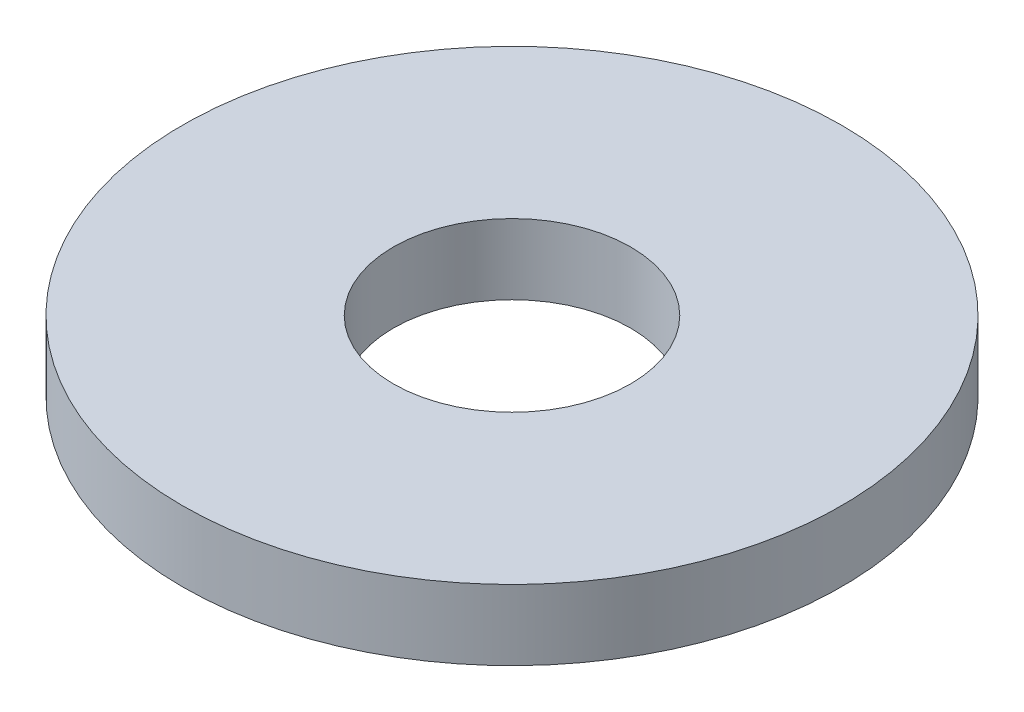
ISO-10303-21;
HEADER;
FILE_DESCRIPTION(('STEP AP214'),'2;1');
FILE_NAME('part.step','',(''),(''),'','','');
FILE_SCHEMA(('AUTOMOTIVE_DESIGN { 1 0 10303 214 1 1 1 1 }'));
ENDSEC;
DATA;
#1=APPLICATION_CONTEXT('core data for automotive mechanical design processes');
#2=APPLICATION_PROTOCOL_DEFINITION('international standard','automotive_design',2000,#1);
#3=PRODUCT_CONTEXT('',#1,'mechanical');
#4=PRODUCT('Part','Part','',(#3));
#5=PRODUCT_RELATED_PRODUCT_CATEGORY('part','',(#4));
#6=PRODUCT_DEFINITION_FORMATION('','',#4);
#7=PRODUCT_DEFINITION_CONTEXT('part definition',#1,'design');
#8=PRODUCT_DEFINITION('design','',#6,#7);
#9=PRODUCT_DEFINITION_SHAPE('','',#8);
#10=(LENGTH_UNIT() NAMED_UNIT(*) SI_UNIT(.MILLI.,.METRE.));
#11=(NAMED_UNIT(*) PLANE_ANGLE_UNIT() SI_UNIT($,.RADIAN.));
#12=(NAMED_UNIT(*) SI_UNIT($,.STERADIAN.) SOLID_ANGLE_UNIT());
#13=UNCERTAINTY_MEASURE_WITH_UNIT(LENGTH_MEASURE(1.E-05),#10,'distance_accuracy_value','');
#14=(GEOMETRIC_REPRESENTATION_CONTEXT(3) GLOBAL_UNCERTAINTY_ASSIGNED_CONTEXT((#13)) GLOBAL_UNIT_ASSIGNED_CONTEXT((#10,
#11,#12)) REPRESENTATION_CONTEXT('',''));
#15=CARTESIAN_POINT('',(0.,0.,0.));
#16=DIRECTION('',(0.,0.,1.));
#17=DIRECTION('',(1.,0.,0.));
#18=AXIS2_PLACEMENT_3D('',#15,#16,#17);
#19=CARTESIAN_POINT('',(0.,0.,0.));
#20=DIRECTION('',(0.,-1.,0.));
#21=DIRECTION('',(0.,0.,-1.));
#22=AXIS2_PLACEMENT_3D('',#19,#20,#21);
#23=CYLINDRICAL_SURFACE('',#22,3.75);
#24=CARTESIAN_POINT('',(0.,0.,0.));
#25=DIRECTION('',(0.,-1.,0.));
#26=DIRECTION('',(0.,0.,-1.));
#27=AXIS2_PLACEMENT_3D('',#24,#25,#26);
#28=CIRCLE('',#27,3.75);
#29=CARTESIAN_POINT('',(0.,0.,-3.75));
#30=VERTEX_POINT('',#29);
#31=EDGE_CURVE('E10',#30,#30,#28,.T.);
#32=ORIENTED_EDGE('',*,*,#31,.F.);
#33=EDGE_LOOP('',(#32));
#34=FACE_BOUND('',#33,.T.);
#35=CARTESIAN_POINT('',(0.,0.8,0.));
#36=DIRECTION('',(0.,-1.,0.));
#37=DIRECTION('',(0.,0.,-1.));
#38=AXIS2_PLACEMENT_3D('',#35,#36,#37);
#39=CIRCLE('',#38,3.75);
#40=CARTESIAN_POINT('',(0.,0.8,-3.75));
#41=VERTEX_POINT('',#40);
#42=EDGE_CURVE('E61',#41,#41,#39,.T.);
#43=ORIENTED_EDGE('',*,*,#42,.T.);
#44=EDGE_LOOP('',(#43));
#45=FACE_BOUND('',#44,.T.);
#46=ADVANCED_FACE('F43',(#34,#45),#23,.T.);
#47=CARTESIAN_POINT('',(-1.35,0.,0.));
#48=DIRECTION('',(0.,1.,0.));
#49=DIRECTION('',(0.,0.,1.));
#50=AXIS2_PLACEMENT_3D('',#47,#48,#49);
#51=PLANE('',#50);
#52=CARTESIAN_POINT('',(0.,0.,0.));
#53=DIRECTION('',(0.,-1.,0.));
#54=DIRECTION('',(0.,0.,-1.));
#55=AXIS2_PLACEMENT_3D('',#52,#53,#54);
#56=CIRCLE('',#55,1.35);
#57=CARTESIAN_POINT('',(0.,0.,-1.35));
#58=VERTEX_POINT('',#57);
#59=EDGE_CURVE('E50',#58,#58,#56,.T.);
#60=ORIENTED_EDGE('',*,*,#59,.F.);
#61=EDGE_LOOP('',(#60));
#62=FACE_BOUND('',#61,.T.);
#63=ORIENTED_EDGE('',*,*,#31,.T.);
#64=EDGE_LOOP('',(#63));
#65=FACE_BOUND('',#64,.T.);
#66=ADVANCED_FACE('F76',(#62,#65),#51,.F.);
#67=CARTESIAN_POINT('',(0.,0.,0.));
#68=DIRECTION('',(0.,-1.,0.));
#69=DIRECTION('',(0.,0.,-1.));
#70=AXIS2_PLACEMENT_3D('',#67,#68,#69);
#71=CYLINDRICAL_SURFACE('',#70,1.35);
#72=CARTESIAN_POINT('',(0.,0.8,0.));
#73=DIRECTION('',(0.,-1.,0.));
#74=DIRECTION('',(0.,0.,-1.));
#75=AXIS2_PLACEMENT_3D('',#72,#73,#74);
#76=CIRCLE('',#75,1.35);
#77=CARTESIAN_POINT('',(0.,0.8,-1.35));
#78=VERTEX_POINT('',#77);
#79=EDGE_CURVE('E56',#78,#78,#76,.T.);
#80=ORIENTED_EDGE('',*,*,#79,.F.);
#81=EDGE_LOOP('',(#80));
#82=FACE_BOUND('',#81,.T.);
#83=ORIENTED_EDGE('',*,*,#59,.T.);
#84=EDGE_LOOP('',(#83));
#85=FACE_BOUND('',#84,.T.);
#86=ADVANCED_FACE('F71',(#82,#85),#71,.F.);
#87=CARTESIAN_POINT('',(-1.35,0.8,0.));
#88=DIRECTION('',(0.,-1.,0.));
#89=DIRECTION('',(0.,0.,-1.));
#90=AXIS2_PLACEMENT_3D('',#87,#88,#89);
#91=PLANE('',#90);
#92=ORIENTED_EDGE('',*,*,#42,.F.);
#93=EDGE_LOOP('',(#92));
#94=FACE_BOUND('',#93,.T.);
#95=ORIENTED_EDGE('',*,*,#79,.T.);
#96=EDGE_LOOP('',(#95));
#97=FACE_BOUND('',#96,.T.);
#98=ADVANCED_FACE('F68',(#94,#97),#91,.F.);
#99=CLOSED_SHELL('',(#46,#66,#86,#98));
#100=MANIFOLD_SOLID_BREP('B2',#99);
#101=ADVANCED_BREP_SHAPE_REPRESENTATION('',(#18,#100),#14);
#102=SHAPE_DEFINITION_REPRESENTATION(#9,#101);
ENDSEC;
END-ISO-10303-21;
